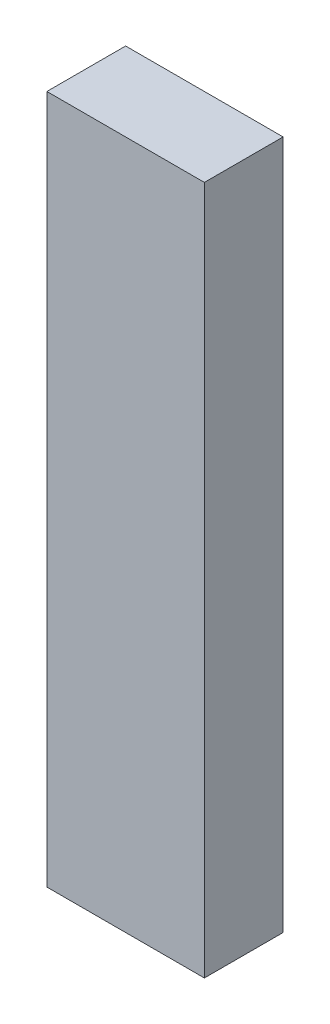
ISO-10303-21;
HEADER;
FILE_DESCRIPTION(('STEP AP214'),'2;1');
FILE_NAME('part.step','',(''),(''),'','','');
FILE_SCHEMA(('AUTOMOTIVE_DESIGN { 1 0 10303 214 1 1 1 1 }'));
ENDSEC;
DATA;
#1=APPLICATION_CONTEXT('core data for automotive mechanical design processes');
#2=APPLICATION_PROTOCOL_DEFINITION('international standard','automotive_design',2000,#1);
#3=PRODUCT_CONTEXT('',#1,'mechanical');
#4=PRODUCT('Part','Part','',(#3));
#5=PRODUCT_RELATED_PRODUCT_CATEGORY('part','',(#4));
#6=PRODUCT_DEFINITION_FORMATION('','',#4);
#7=PRODUCT_DEFINITION_CONTEXT('part definition',#1,'design');
#8=PRODUCT_DEFINITION('design','',#6,#7);
#9=PRODUCT_DEFINITION_SHAPE('','',#8);
#10=(LENGTH_UNIT() NAMED_UNIT(*) SI_UNIT(.MILLI.,.METRE.));
#11=(NAMED_UNIT(*) PLANE_ANGLE_UNIT() SI_UNIT($,.RADIAN.));
#12=(NAMED_UNIT(*) SI_UNIT($,.STERADIAN.) SOLID_ANGLE_UNIT());
#13=UNCERTAINTY_MEASURE_WITH_UNIT(LENGTH_MEASURE(1.E-05),#10,'distance_accuracy_value','');
#14=(GEOMETRIC_REPRESENTATION_CONTEXT(3) GLOBAL_UNCERTAINTY_ASSIGNED_CONTEXT((#13)) GLOBAL_UNIT_ASSIGNED_CONTEXT((#10,
#11,#12)) REPRESENTATION_CONTEXT('',''));
#15=CARTESIAN_POINT('',(0.,0.,0.));
#16=DIRECTION('',(0.,0.,1.));
#17=DIRECTION('',(1.,0.,0.));
#18=AXIS2_PLACEMENT_3D('',#15,#16,#17);
#19=CARTESIAN_POINT('',(-5.08,22.225,5.08));
#20=DIRECTION('',(1.,0.,0.));
#21=DIRECTION('',(0.,1.,0.));
#22=AXIS2_PLACEMENT_3D('',#19,#20,#21);
#23=PLANE('',#22);
#24=DIRECTION('',(0.,-1.,0.));
#25=VECTOR('',#24,1.);
#26=CARTESIAN_POINT('',(-5.08,22.225,0.));
#27=LINE('',#26,#25);
#28=CARTESIAN_POINT('',(-5.08,22.225,0.));
#29=VERTEX_POINT('',#28);
#30=CARTESIAN_POINT('',(-5.08,-22.225,0.));
#31=VERTEX_POINT('',#30);
#32=EDGE_CURVE('E95',#29,#31,#27,.T.);
#33=ORIENTED_EDGE('',*,*,#32,.T.);
#34=DIRECTION('',(0.,0.,-1.));
#35=VECTOR('',#34,1.);
#36=CARTESIAN_POINT('',(-5.08,-22.225,5.08));
#37=LINE('',#36,#35);
#38=CARTESIAN_POINT('',(-5.08,-22.225,5.08));
#39=VERTEX_POINT('',#38);
#40=EDGE_CURVE('E11',#39,#31,#37,.T.);
#41=ORIENTED_EDGE('',*,*,#40,.F.);
#42=DIRECTION('',(0.,-1.,0.));
#43=VECTOR('',#42,1.);
#44=CARTESIAN_POINT('',(-5.08,22.225,5.08));
#45=LINE('',#44,#43);
#46=CARTESIAN_POINT('',(-5.08,22.225,5.08));
#47=VERTEX_POINT('',#46);
#48=EDGE_CURVE('E83',#47,#39,#45,.T.);
#49=ORIENTED_EDGE('',*,*,#48,.F.);
#50=DIRECTION('',(0.,0.,-1.));
#51=VECTOR('',#50,1.);
#52=CARTESIAN_POINT('',(-5.08,22.225,5.08));
#53=LINE('',#52,#51);
#54=EDGE_CURVE('E91',#47,#29,#53,.T.);
#55=ORIENTED_EDGE('',*,*,#54,.T.);
#56=EDGE_LOOP('',(#33,#41,#49,#55));
#57=FACE_BOUND('',#56,.T.);
#58=ADVANCED_FACE('F32',(#57),#23,.F.);
#59=CARTESIAN_POINT('',(5.08,-22.225,5.08));
#60=DIRECTION('',(0.,1.,0.));
#61=DIRECTION('',(0.,0.,1.));
#62=AXIS2_PLACEMENT_3D('',#59,#60,#61);
#63=PLANE('',#62);
#64=DIRECTION('',(1.,0.,0.));
#65=VECTOR('',#64,1.);
#66=CARTESIAN_POINT('',(5.08,-22.225,0.));
#67=LINE('',#66,#65);
#68=CARTESIAN_POINT('',(5.08,-22.225,0.));
#69=VERTEX_POINT('',#68);
#70=EDGE_CURVE('E87',#31,#69,#67,.T.);
#71=ORIENTED_EDGE('',*,*,#70,.T.);
#72=DIRECTION('',(0.,0.,-1.));
#73=VECTOR('',#72,1.);
#74=CARTESIAN_POINT('',(5.08,-22.225,5.08));
#75=LINE('',#74,#73);
#76=CARTESIAN_POINT('',(5.08,-22.225,5.08));
#77=VERTEX_POINT('',#76);
#78=EDGE_CURVE('E40',#77,#69,#75,.T.);
#79=ORIENTED_EDGE('',*,*,#78,.F.);
#80=DIRECTION('',(1.,0.,0.));
#81=VECTOR('',#80,1.);
#82=CARTESIAN_POINT('',(5.08,-22.225,5.08));
#83=LINE('',#82,#81);
#84=EDGE_CURVE('E78',#39,#77,#83,.T.);
#85=ORIENTED_EDGE('',*,*,#84,.F.);
#86=ORIENTED_EDGE('',*,*,#40,.T.);
#87=EDGE_LOOP('',(#71,#79,#85,#86));
#88=FACE_BOUND('',#87,.T.);
#89=ADVANCED_FACE('F86',(#88),#63,.F.);
#90=CARTESIAN_POINT('',(5.08,22.225,5.08));
#91=DIRECTION('',(-1.,0.,0.));
#92=DIRECTION('',(0.,-1.,0.));
#93=AXIS2_PLACEMENT_3D('',#90,#91,#92);
#94=PLANE('',#93);
#95=DIRECTION('',(0.,1.,0.));
#96=VECTOR('',#95,1.);
#97=CARTESIAN_POINT('',(5.08,22.225,0.));
#98=LINE('',#97,#96);
#99=CARTESIAN_POINT('',(5.08,22.225,0.));
#100=VERTEX_POINT('',#99);
#101=EDGE_CURVE('E65',#69,#100,#98,.T.);
#102=ORIENTED_EDGE('',*,*,#101,.T.);
#103=DIRECTION('',(0.,0.,-1.));
#104=VECTOR('',#103,1.);
#105=CARTESIAN_POINT('',(5.08,22.225,5.08));
#106=LINE('',#105,#104);
#107=CARTESIAN_POINT('',(5.08,22.225,5.08));
#108=VERTEX_POINT('',#107);
#109=EDGE_CURVE('E88',#108,#100,#106,.T.);
#110=ORIENTED_EDGE('',*,*,#109,.F.);
#111=DIRECTION('',(0.,1.,0.));
#112=VECTOR('',#111,1.);
#113=CARTESIAN_POINT('',(5.08,22.225,5.08));
#114=LINE('',#113,#112);
#115=EDGE_CURVE('E81',#77,#108,#114,.T.);
#116=ORIENTED_EDGE('',*,*,#115,.F.);
#117=ORIENTED_EDGE('',*,*,#78,.T.);
#118=EDGE_LOOP('',(#102,#110,#116,#117));
#119=FACE_BOUND('',#118,.T.);
#120=ADVANCED_FACE('F89',(#119),#94,.F.);
#121=CARTESIAN_POINT('',(5.08,22.225,5.08));
#122=DIRECTION('',(0.,-1.,0.));
#123=DIRECTION('',(0.,0.,-1.));
#124=AXIS2_PLACEMENT_3D('',#121,#122,#123);
#125=PLANE('',#124);
#126=DIRECTION('',(-1.,0.,0.));
#127=VECTOR('',#126,1.);
#128=CARTESIAN_POINT('',(5.08,22.225,0.));
#129=LINE('',#128,#127);
#130=EDGE_CURVE('E71',#100,#29,#129,.T.);
#131=ORIENTED_EDGE('',*,*,#130,.T.);
#132=ORIENTED_EDGE('',*,*,#54,.F.);
#133=DIRECTION('',(-1.,0.,0.));
#134=VECTOR('',#133,1.);
#135=CARTESIAN_POINT('',(5.08,22.225,5.08));
#136=LINE('',#135,#134);
#137=EDGE_CURVE('E48',#108,#47,#136,.T.);
#138=ORIENTED_EDGE('',*,*,#137,.F.);
#139=ORIENTED_EDGE('',*,*,#109,.T.);
#140=EDGE_LOOP('',(#131,#132,#138,#139));
#141=FACE_BOUND('',#140,.T.);
#142=ADVANCED_FACE('F102',(#141),#125,.F.);
#143=CARTESIAN_POINT('',(0.,0.,5.08));
#144=DIRECTION('',(0.,0.,-1.));
#145=DIRECTION('',(-1.,0.,0.));
#146=AXIS2_PLACEMENT_3D('',#143,#144,#145);
#147=PLANE('',#146);
#148=ORIENTED_EDGE('',*,*,#48,.T.);
#149=ORIENTED_EDGE('',*,*,#84,.T.);
#150=ORIENTED_EDGE('',*,*,#115,.T.);
#151=ORIENTED_EDGE('',*,*,#137,.T.);
#152=EDGE_LOOP('',(#148,#149,#150,#151));
#153=FACE_BOUND('',#152,.T.);
#154=ADVANCED_FACE('F79',(#153),#147,.F.);
#155=CARTESIAN_POINT('',(0.,0.,0.));
#156=DIRECTION('',(0.,0.,-1.));
#157=DIRECTION('',(-1.,0.,0.));
#158=AXIS2_PLACEMENT_3D('',#155,#156,#157);
#159=PLANE('',#158);
#160=ORIENTED_EDGE('',*,*,#32,.F.);
#161=ORIENTED_EDGE('',*,*,#130,.F.);
#162=ORIENTED_EDGE('',*,*,#101,.F.);
#163=ORIENTED_EDGE('',*,*,#70,.F.);
#164=EDGE_LOOP('',(#160,#161,#162,#163));
#165=FACE_BOUND('',#164,.T.);
#166=ADVANCED_FACE('F105',(#165),#159,.T.);
#167=CLOSED_SHELL('',(#58,#89,#120,#142,#154,#166));
#168=MANIFOLD_SOLID_BREP('B2',#167);
#169=ADVANCED_BREP_SHAPE_REPRESENTATION('',(#18,#168),#14);
#170=SHAPE_DEFINITION_REPRESENTATION(#9,#169);
ENDSEC;
END-ISO-10303-21;
